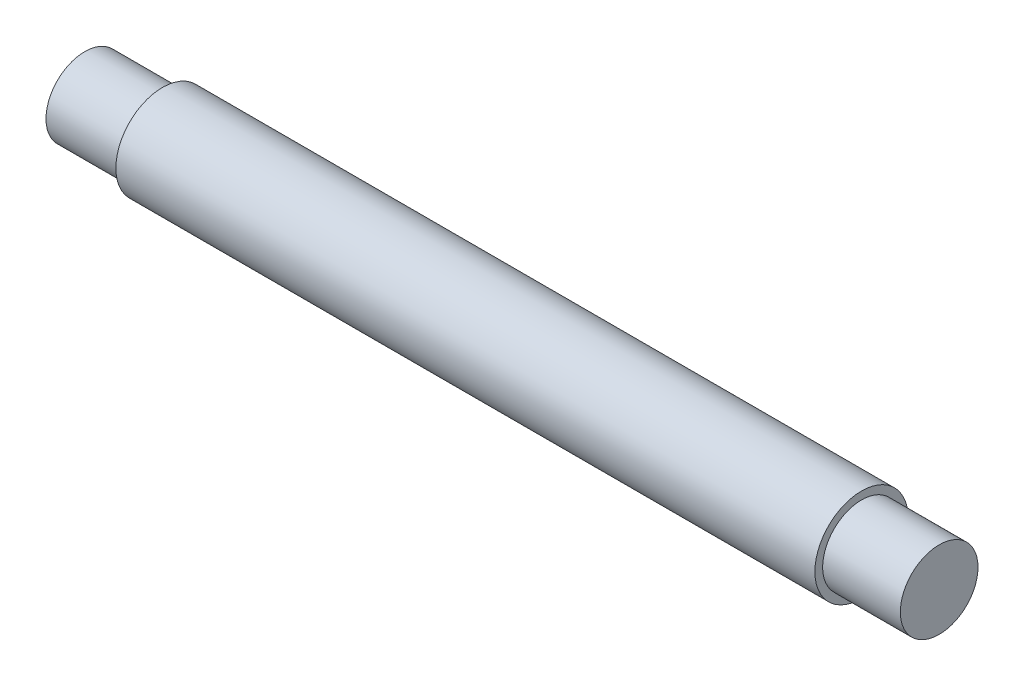
ISO-10303-21;
HEADER;
FILE_DESCRIPTION(('STEP AP214'),'2;1');
FILE_NAME('part.step','',(''),(''),'','','');
FILE_SCHEMA(('AUTOMOTIVE_DESIGN { 1 0 10303 214 1 1 1 1 }'));
ENDSEC;
DATA;
#1=APPLICATION_CONTEXT('core data for automotive mechanical design processes');
#2=APPLICATION_PROTOCOL_DEFINITION('international standard','automotive_design',2000,#1);
#3=PRODUCT_CONTEXT('',#1,'mechanical');
#4=PRODUCT('Part','Part','',(#3));
#5=PRODUCT_RELATED_PRODUCT_CATEGORY('part','',(#4));
#6=PRODUCT_DEFINITION_FORMATION('','',#4);
#7=PRODUCT_DEFINITION_CONTEXT('part definition',#1,'design');
#8=PRODUCT_DEFINITION('design','',#6,#7);
#9=PRODUCT_DEFINITION_SHAPE('','',#8);
#10=(LENGTH_UNIT() NAMED_UNIT(*) SI_UNIT(.MILLI.,.METRE.));
#11=(NAMED_UNIT(*) PLANE_ANGLE_UNIT() SI_UNIT($,.RADIAN.));
#12=(NAMED_UNIT(*) SI_UNIT($,.STERADIAN.) SOLID_ANGLE_UNIT());
#13=UNCERTAINTY_MEASURE_WITH_UNIT(LENGTH_MEASURE(1.E-05),#10,'distance_accuracy_value','');
#14=(GEOMETRIC_REPRESENTATION_CONTEXT(3) GLOBAL_UNCERTAINTY_ASSIGNED_CONTEXT((#13)) GLOBAL_UNIT_ASSIGNED_CONTEXT((#10,
#11,#12)) REPRESENTATION_CONTEXT('',''));
#15=CARTESIAN_POINT('',(0.,0.,0.));
#16=DIRECTION('',(0.,0.,1.));
#17=DIRECTION('',(1.,0.,0.));
#18=AXIS2_PLACEMENT_3D('',#15,#16,#17);
#19=CARTESIAN_POINT('',(110.,0.,0.));
#20=DIRECTION('',(-1.,0.,0.));
#21=DIRECTION('',(0.,0.,1.));
#22=AXIS2_PLACEMENT_3D('',#19,#20,#21);
#23=CYLINDRICAL_SURFACE('',#22,6.);
#24=CARTESIAN_POINT('',(100.,0.,0.));
#25=DIRECTION('',(1.,0.,0.));
#26=DIRECTION('',(0.,0.,-1.));
#27=AXIS2_PLACEMENT_3D('',#24,#25,#26);
#28=CIRCLE('',#27,6.);
#29=CARTESIAN_POINT('',(100.,0.,-6.));
#30=VERTEX_POINT('',#29);
#31=EDGE_CURVE('E11',#30,#30,#28,.T.);
#32=ORIENTED_EDGE('',*,*,#31,.F.);
#33=EDGE_LOOP('',(#32));
#34=FACE_BOUND('',#33,.T.);
#35=CARTESIAN_POINT('',(9.99999999999999,0.,0.));
#36=DIRECTION('',(-1.,0.,0.));
#37=DIRECTION('',(0.,0.,1.));
#38=AXIS2_PLACEMENT_3D('',#35,#36,#37);
#39=CIRCLE('',#38,6.);
#40=CARTESIAN_POINT('',(9.99999999999999,0.,6.));
#41=VERTEX_POINT('',#40);
#42=EDGE_CURVE('E43',#41,#41,#39,.T.);
#43=ORIENTED_EDGE('',*,*,#42,.F.);
#44=EDGE_LOOP('',(#43));
#45=FACE_BOUND('',#44,.T.);
#46=ADVANCED_FACE('F40',(#34,#45),#23,.T.);
#47=CARTESIAN_POINT('',(100.,0.,0.));
#48=DIRECTION('',(1.,0.,0.));
#49=DIRECTION('',(0.,0.,-1.));
#50=AXIS2_PLACEMENT_3D('',#47,#48,#49);
#51=PLANE('',#50);
#52=CARTESIAN_POINT('',(100.,0.,0.));
#53=DIRECTION('',(1.,0.,0.));
#54=DIRECTION('',(0.,0.,-1.));
#55=AXIS2_PLACEMENT_3D('',#52,#53,#54);
#56=CIRCLE('',#55,5.);
#57=CARTESIAN_POINT('',(100.,0.,-5.));
#58=VERTEX_POINT('',#57);
#59=EDGE_CURVE('E47',#58,#58,#56,.T.);
#60=ORIENTED_EDGE('',*,*,#59,.F.);
#61=EDGE_LOOP('',(#60));
#62=FACE_BOUND('',#61,.T.);
#63=ORIENTED_EDGE('',*,*,#31,.T.);
#64=EDGE_LOOP('',(#63));
#65=FACE_BOUND('',#64,.T.);
#66=ADVANCED_FACE('F69',(#62,#65),#51,.T.);
#67=CARTESIAN_POINT('',(100.,0.,0.));
#68=DIRECTION('',(1.,0.,0.));
#69=DIRECTION('',(0.,0.,-1.));
#70=AXIS2_PLACEMENT_3D('',#67,#68,#69);
#71=CYLINDRICAL_SURFACE('',#70,5.);
#72=ORIENTED_EDGE('',*,*,#59,.T.);
#73=EDGE_LOOP('',(#72));
#74=FACE_BOUND('',#73,.T.);
#75=CARTESIAN_POINT('',(110.,0.,0.));
#76=DIRECTION('',(1.,0.,0.));
#77=DIRECTION('',(0.,0.,-1.));
#78=AXIS2_PLACEMENT_3D('',#75,#76,#77);
#79=CIRCLE('',#78,5.);
#80=CARTESIAN_POINT('',(110.,0.,-5.));
#81=VERTEX_POINT('',#80);
#82=EDGE_CURVE('E51',#81,#81,#79,.T.);
#83=ORIENTED_EDGE('',*,*,#82,.F.);
#84=EDGE_LOOP('',(#83));
#85=FACE_BOUND('',#84,.T.);
#86=ADVANCED_FACE('F74',(#74,#85),#71,.T.);
#87=CARTESIAN_POINT('',(110.,0.,0.));
#88=DIRECTION('',(1.,0.,0.));
#89=DIRECTION('',(0.,0.,-1.));
#90=AXIS2_PLACEMENT_3D('',#87,#88,#89);
#91=PLANE('',#90);
#92=ORIENTED_EDGE('',*,*,#82,.T.);
#93=EDGE_LOOP('',(#92));
#94=FACE_BOUND('',#93,.T.);
#95=ADVANCED_FACE('F80',(#94),#91,.T.);
#96=CARTESIAN_POINT('',(10.,0.,0.));
#97=DIRECTION('',(-1.,0.,0.));
#98=DIRECTION('',(0.,0.,1.));
#99=AXIS2_PLACEMENT_3D('',#96,#97,#98);
#100=PLANE('',#99);
#101=CARTESIAN_POINT('',(10.,0.,0.));
#102=DIRECTION('',(-1.,0.,0.));
#103=DIRECTION('',(0.,0.,1.));
#104=AXIS2_PLACEMENT_3D('',#101,#102,#103);
#105=CIRCLE('',#104,5.);
#106=CARTESIAN_POINT('',(10.,0.,5.));
#107=VERTEX_POINT('',#106);
#108=EDGE_CURVE('E59',#107,#107,#105,.T.);
#109=ORIENTED_EDGE('',*,*,#108,.F.);
#110=EDGE_LOOP('',(#109));
#111=FACE_BOUND('',#110,.T.);
#112=ORIENTED_EDGE('',*,*,#42,.T.);
#113=EDGE_LOOP('',(#112));
#114=FACE_BOUND('',#113,.T.);
#115=ADVANCED_FACE('F66',(#111,#114),#100,.T.);
#116=CARTESIAN_POINT('',(10.,0.,0.));
#117=DIRECTION('',(-1.,0.,0.));
#118=DIRECTION('',(0.,0.,1.));
#119=AXIS2_PLACEMENT_3D('',#116,#117,#118);
#120=CYLINDRICAL_SURFACE('',#119,5.);
#121=ORIENTED_EDGE('',*,*,#108,.T.);
#122=EDGE_LOOP('',(#121));
#123=FACE_BOUND('',#122,.T.);
#124=CARTESIAN_POINT('',(0.,0.,0.));
#125=DIRECTION('',(-1.,0.,0.));
#126=DIRECTION('',(0.,0.,1.));
#127=AXIS2_PLACEMENT_3D('',#124,#125,#126);
#128=CIRCLE('',#127,5.);
#129=CARTESIAN_POINT('',(0.,0.,5.));
#130=VERTEX_POINT('',#129);
#131=EDGE_CURVE('E56',#130,#130,#128,.T.);
#132=ORIENTED_EDGE('',*,*,#131,.F.);
#133=EDGE_LOOP('',(#132));
#134=FACE_BOUND('',#133,.T.);
#135=ADVANCED_FACE('F90',(#123,#134),#120,.T.);
#136=CARTESIAN_POINT('',(0.,0.,0.));
#137=DIRECTION('',(1.,0.,0.));
#138=DIRECTION('',(0.,0.,-1.));
#139=AXIS2_PLACEMENT_3D('',#136,#137,#138);
#140=PLANE('',#139);
#141=ORIENTED_EDGE('',*,*,#131,.T.);
#142=EDGE_LOOP('',(#141));
#143=FACE_BOUND('',#142,.T.);
#144=ADVANCED_FACE('F88',(#143),#140,.F.);
#145=CLOSED_SHELL('',(#46,#66,#86,#95,#115,#135,#144));
#146=MANIFOLD_SOLID_BREP('B2',#145);
#147=ADVANCED_BREP_SHAPE_REPRESENTATION('',(#18,#146),#14);
#148=SHAPE_DEFINITION_REPRESENTATION(#9,#147);
ENDSEC;
END-ISO-10303-21;
